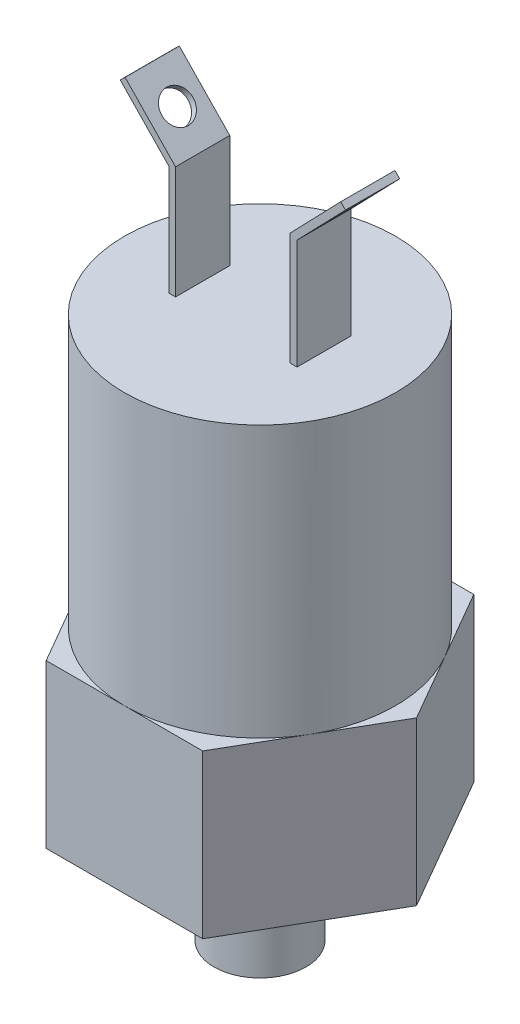
ISO-10303-21;
HEADER;
FILE_DESCRIPTION(('STEP AP214'),'2;1');
FILE_NAME('part.step','',(''),(''),'','','');
FILE_SCHEMA(('AUTOMOTIVE_DESIGN { 1 0 10303 214 1 1 1 1 }'));
ENDSEC;
DATA;
#1=APPLICATION_CONTEXT('core data for automotive mechanical design processes');
#2=APPLICATION_PROTOCOL_DEFINITION('international standard','automotive_design',2000,#1);
#3=PRODUCT_CONTEXT('',#1,'mechanical');
#4=PRODUCT('Part','Part','',(#3));
#5=PRODUCT_RELATED_PRODUCT_CATEGORY('part','',(#4));
#6=PRODUCT_DEFINITION_FORMATION('','',#4);
#7=PRODUCT_DEFINITION_CONTEXT('part definition',#1,'design');
#8=PRODUCT_DEFINITION('design','',#6,#7);
#9=PRODUCT_DEFINITION_SHAPE('','',#8);
#10=(LENGTH_UNIT() NAMED_UNIT(*) SI_UNIT(.MILLI.,.METRE.));
#11=(NAMED_UNIT(*) PLANE_ANGLE_UNIT() SI_UNIT($,.RADIAN.));
#12=(NAMED_UNIT(*) SI_UNIT($,.STERADIAN.) SOLID_ANGLE_UNIT());
#13=UNCERTAINTY_MEASURE_WITH_UNIT(LENGTH_MEASURE(1.E-05),#10,'distance_accuracy_value','');
#14=(GEOMETRIC_REPRESENTATION_CONTEXT(3) GLOBAL_UNCERTAINTY_ASSIGNED_CONTEXT((#13)) GLOBAL_UNIT_ASSIGNED_CONTEXT((#10,
#11,#12)) REPRESENTATION_CONTEXT('',''));
#15=CARTESIAN_POINT('',(0.,0.,0.));
#16=DIRECTION('',(0.,0.,1.));
#17=DIRECTION('',(1.,0.,0.));
#18=AXIS2_PLACEMENT_3D('',#15,#16,#17);
#19=CARTESIAN_POINT('',(-5.91916388064722,50.854740059957,2.54));
#20=DIRECTION('',(-0.719626723782185,-0.694361129685785,0.));
#21=DIRECTION('',(0.694361129685785,-0.719626723782185,0.));
#22=AXIS2_PLACEMENT_3D('',#19,#20,#21);
#23=PLANE('',#22);
#24=DIRECTION('',(-0.694361129685785,0.719626723782185,0.));
#25=VECTOR('',#24,1.);
#26=CARTESIAN_POINT('',(-5.91916388064722,50.854740059957,-2.54));
#27=LINE('',#26,#25);
#28=CARTESIAN_POINT('',(-6.00818239584637,50.9469976759295,-2.54));
#29=VERTEX_POINT('',#28);
#30=CARTESIAN_POINT('',(-10.5552709637061,55.6595403413248,-2.54));
#31=VERTEX_POINT('',#30);
#32=EDGE_CURVE('E181',#29,#31,#27,.T.);
#33=ORIENTED_EDGE('',*,*,#32,.F.);
#34=DIRECTION('',(0.,0.,-1.));
#35=VECTOR('',#34,1.);
#36=CARTESIAN_POINT('',(-6.00818239584637,50.9469976759295,2.54));
#37=LINE('',#36,#35);
#38=CARTESIAN_POINT('',(-6.00818239584637,50.9469976759295,2.54));
#39=VERTEX_POINT('',#38);
#40=EDGE_CURVE('E176',#39,#29,#37,.T.);
#41=ORIENTED_EDGE('',*,*,#40,.F.);
#42=DIRECTION('',(-0.694361129685785,0.719626723782185,0.));
#43=VECTOR('',#42,1.);
#44=CARTESIAN_POINT('',(-5.91916388064722,50.854740059957,2.54));
#45=LINE('',#44,#43);
#46=CARTESIAN_POINT('',(-10.5552709637061,55.6595403413248,2.54));
#47=VERTEX_POINT('',#46);
#48=EDGE_CURVE('E179',#39,#47,#45,.T.);
#49=ORIENTED_EDGE('',*,*,#48,.T.);
#50=DIRECTION('',(0.,0.,-1.));
#51=VECTOR('',#50,1.);
#52=CARTESIAN_POINT('',(-10.5552709637061,55.6595403413248,2.54));
#53=LINE('',#52,#51);
#54=EDGE_CURVE('E208',#47,#31,#53,.T.);
#55=ORIENTED_EDGE('',*,*,#54,.T.);
#56=EDGE_LOOP('',(#33,#41,#49,#55));
#57=FACE_BOUND('',#56,.T.);
#58=CARTESIAN_POINT('',(-8.19270816457709,53.2110113926547,0.));
#59=DIRECTION('',(-0.719626723782185,-0.694361129685785,0.));
#60=DIRECTION('',(0.694361129685785,-0.719626723782185,0.));
#61=AXIS2_PLACEMENT_3D('',#58,#59,#60);
#62=CIRCLE('',#61,1.4605);
#63=CARTESIAN_POINT('',(-7.17859373467101,52.1599965625708,0.));
#64=VERTEX_POINT('',#63);
#65=EDGE_CURVE('E211',#64,#64,#62,.T.);
#66=ORIENTED_EDGE('',*,*,#65,.F.);
#67=EDGE_LOOP('',(#66));
#68=FACE_BOUND('',#67,.T.);
#69=ADVANCED_FACE('F35',(#57,#68),#23,.T.);
#70=CARTESIAN_POINT('',(-5.46220091104553,51.2956593773075,2.54));
#71=DIRECTION('',(-0.719626723782185,-0.694361129685785,0.));
#72=DIRECTION('',(0.694361129685785,-0.719626723782185,0.));
#73=AXIS2_PLACEMENT_3D('',#70,#71,#72);
#74=PLANE('',#73);
#75=DIRECTION('',(-0.694361129685785,0.719626723782185,0.));
#76=VECTOR('',#75,1.);
#77=CARTESIAN_POINT('',(-5.46220091104553,51.2956593773075,-2.54));
#78=LINE('',#77,#76);
#79=CARTESIAN_POINT('',(-5.37318239584637,51.2034017613351,-2.54));
#80=VERTEX_POINT('',#79);
#81=CARTESIAN_POINT('',(-10.0983079941044,56.1004596586752,-2.54));
#82=VERTEX_POINT('',#81);
#83=EDGE_CURVE('E217',#80,#82,#78,.T.);
#84=ORIENTED_EDGE('',*,*,#83,.T.);
#85=DIRECTION('',(0.,0.,-1.));
#86=VECTOR('',#85,1.);
#87=CARTESIAN_POINT('',(-10.0983079941044,56.1004596586752,2.54));
#88=LINE('',#87,#86);
#89=CARTESIAN_POINT('',(-10.0983079941044,56.1004596586752,2.54));
#90=VERTEX_POINT('',#89);
#91=EDGE_CURVE('E222',#90,#82,#88,.T.);
#92=ORIENTED_EDGE('',*,*,#91,.F.);
#93=DIRECTION('',(-0.694361129685785,0.719626723782185,0.));
#94=VECTOR('',#93,1.);
#95=CARTESIAN_POINT('',(-5.46220091104553,51.2956593773075,2.54));
#96=LINE('',#95,#94);
#97=CARTESIAN_POINT('',(-5.37318239584637,51.2034017613351,2.54));
#98=VERTEX_POINT('',#97);
#99=EDGE_CURVE('E205',#98,#90,#96,.T.);
#100=ORIENTED_EDGE('',*,*,#99,.F.);
#101=DIRECTION('',(0.,0.,-1.));
#102=VECTOR('',#101,1.);
#103=CARTESIAN_POINT('',(-5.37318239584637,51.2034017613351,2.54));
#104=LINE('',#103,#102);
#105=EDGE_CURVE('E225',#98,#80,#104,.T.);
#106=ORIENTED_EDGE('',*,*,#105,.T.);
#107=EDGE_LOOP('',(#84,#92,#100,#106));
#108=FACE_BOUND('',#107,.T.);
#109=CARTESIAN_POINT('',(-7.73574519497541,53.6519307100052,0.));
#110=DIRECTION('',(-0.719626723782185,-0.694361129685785,0.));
#111=DIRECTION('',(0.694361129685785,-0.719626723782185,0.));
#112=AXIS2_PLACEMENT_3D('',#109,#110,#111);
#113=CIRCLE('',#112,1.4605);
#114=CARTESIAN_POINT('',(-6.72163076506932,52.6009158799213,0.));
#115=VERTEX_POINT('',#114);
#116=EDGE_CURVE('E677',#115,#115,#113,.T.);
#117=ORIENTED_EDGE('',*,*,#116,.T.);
#118=EDGE_LOOP('',(#117));
#119=FACE_BOUND('',#118,.T.);
#120=ADVANCED_FACE('F417',(#108,#119),#74,.F.);
#121=CARTESIAN_POINT('',(0.,40.64,0.));
#122=DIRECTION('',(0.,1.,0.));
#123=DIRECTION('',(0.,0.,1.));
#124=AXIS2_PLACEMENT_3D('',#121,#122,#123);
#125=PLANE('',#124);
#126=DIRECTION('',(0.,0.,-1.));
#127=VECTOR('',#126,1.);
#128=CARTESIAN_POINT('',(6.00818239584637,40.64,2.54));
#129=LINE('',#128,#127);
#130=CARTESIAN_POINT('',(6.00818239584637,40.64,2.54));
#131=VERTEX_POINT('',#130);
#132=CARTESIAN_POINT('',(6.00818239584637,40.64,-2.54));
#133=VERTEX_POINT('',#132);
#134=EDGE_CURVE('E270',#131,#133,#129,.T.);
#135=ORIENTED_EDGE('',*,*,#134,.F.);
#136=DIRECTION('',(-1.,0.,0.));
#137=VECTOR('',#136,1.);
#138=CARTESIAN_POINT('',(6.00818239584637,40.64,2.54));
#139=LINE('',#138,#137);
#140=CARTESIAN_POINT('',(5.37318239584637,40.64,2.54));
#141=VERTEX_POINT('',#140);
#142=EDGE_CURVE('E248',#131,#141,#139,.T.);
#143=ORIENTED_EDGE('',*,*,#142,.T.);
#144=DIRECTION('',(0.,0.,-1.));
#145=VECTOR('',#144,1.);
#146=CARTESIAN_POINT('',(5.37318239584637,40.64,2.54));
#147=LINE('',#146,#145);
#148=CARTESIAN_POINT('',(5.37318239584637,40.64,-2.54));
#149=VERTEX_POINT('',#148);
#150=EDGE_CURVE('E273',#141,#149,#147,.T.);
#151=ORIENTED_EDGE('',*,*,#150,.T.);
#152=DIRECTION('',(-1.,0.,0.));
#153=VECTOR('',#152,1.);
#154=CARTESIAN_POINT('',(6.00818239584637,40.64,-2.54));
#155=LINE('',#154,#153);
#156=EDGE_CURVE('E264',#133,#149,#155,.T.);
#157=ORIENTED_EDGE('',*,*,#156,.F.);
#158=EDGE_LOOP('',(#135,#143,#151,#157));
#159=FACE_BOUND('',#158,.T.);
#160=CARTESIAN_POINT('',(0.,40.64,0.));
#161=DIRECTION('',(0.,1.,0.));
#162=DIRECTION('',(0.,0.,1.));
#163=AXIS2_PLACEMENT_3D('',#160,#161,#162);
#164=CIRCLE('',#163,12.7);
#165=CARTESIAN_POINT('',(0.,40.64,12.7));
#166=VERTEX_POINT('',#165);
#167=EDGE_CURVE('E285',#166,#166,#164,.T.);
#168=ORIENTED_EDGE('',*,*,#167,.T.);
#169=EDGE_LOOP('',(#168));
#170=FACE_BOUND('',#169,.T.);
#171=DIRECTION('',(0.,0.,-1.));
#172=VECTOR('',#171,1.);
#173=CARTESIAN_POINT('',(-5.37318239584637,40.64,2.54));
#174=LINE('',#173,#172);
#175=CARTESIAN_POINT('',(-5.37318239584637,40.64,2.54));
#176=VERTEX_POINT('',#175);
#177=CARTESIAN_POINT('',(-5.37318239584637,40.64,-2.54));
#178=VERTEX_POINT('',#177);
#179=EDGE_CURVE('E55',#176,#178,#174,.T.);
#180=ORIENTED_EDGE('',*,*,#179,.F.);
#181=DIRECTION('',(1.,0.,0.));
#182=VECTOR('',#181,1.);
#183=CARTESIAN_POINT('',(-6.00818239584637,40.64,2.54));
#184=LINE('',#183,#182);
#185=CARTESIAN_POINT('',(-6.00818239584637,40.64,2.54));
#186=VERTEX_POINT('',#185);
#187=EDGE_CURVE('E50',#186,#176,#184,.T.);
#188=ORIENTED_EDGE('',*,*,#187,.F.);
#189=DIRECTION('',(0.,0.,-1.));
#190=VECTOR('',#189,1.);
#191=CARTESIAN_POINT('',(-6.00818239584637,40.64,2.54));
#192=LINE('',#191,#190);
#193=CARTESIAN_POINT('',(-6.00818239584637,40.64,-2.54));
#194=VERTEX_POINT('',#193);
#195=EDGE_CURVE('E187',#186,#194,#192,.T.);
#196=ORIENTED_EDGE('',*,*,#195,.T.);
#197=DIRECTION('',(1.,0.,0.));
#198=VECTOR('',#197,1.);
#199=CARTESIAN_POINT('',(-6.00818239584637,40.64,-2.54));
#200=LINE('',#199,#198);
#201=EDGE_CURVE('E213',#194,#178,#200,.T.);
#202=ORIENTED_EDGE('',*,*,#201,.T.);
#203=EDGE_LOOP('',(#180,#188,#196,#202));
#204=FACE_BOUND('',#203,.T.);
#205=ADVANCED_FACE('F422',(#159,#170,#204),#125,.T.);
#206=CARTESIAN_POINT('',(0.,0.,0.));
#207=DIRECTION('',(0.,1.,0.));
#208=DIRECTION('',(0.,0.,1.));
#209=AXIS2_PLACEMENT_3D('',#206,#207,#208);
#210=PLANE('',#209);
#211=DIRECTION('',(-0.5,0.,-0.866025403784439));
#212=VECTOR('',#211,1.);
#213=CARTESIAN_POINT('',(14.6646968374165,0.,0.));
#214=LINE('',#213,#212);
#215=CARTESIAN_POINT('',(14.6646968374165,0.,0.));
#216=VERTEX_POINT('',#215);
#217=CARTESIAN_POINT('',(7.33234841870825,0.,-12.7));
#218=VERTEX_POINT('',#217);
#219=EDGE_CURVE('E288',#216,#218,#214,.T.);
#220=ORIENTED_EDGE('',*,*,#219,.F.);
#221=DIRECTION('',(0.5,0.,-0.866025403784439));
#222=VECTOR('',#221,1.);
#223=CARTESIAN_POINT('',(7.33234841870825,0.,12.7));
#224=LINE('',#223,#222);
#225=CARTESIAN_POINT('',(7.33234841870825,0.,12.7));
#226=VERTEX_POINT('',#225);
#227=EDGE_CURVE('E326',#226,#216,#224,.T.);
#228=ORIENTED_EDGE('',*,*,#227,.F.);
#229=DIRECTION('',(1.,0.,0.));
#230=VECTOR('',#229,1.);
#231=CARTESIAN_POINT('',(-7.33234841870824,0.,12.7));
#232=LINE('',#231,#230);
#233=CARTESIAN_POINT('',(-7.33234841870824,0.,12.7));
#234=VERTEX_POINT('',#233);
#235=EDGE_CURVE('E324',#234,#226,#232,.T.);
#236=ORIENTED_EDGE('',*,*,#235,.F.);
#237=DIRECTION('',(0.5,0.,0.866025403784439));
#238=VECTOR('',#237,1.);
#239=CARTESIAN_POINT('',(-14.6646968374165,0.,0.));
#240=LINE('',#239,#238);
#241=CARTESIAN_POINT('',(-14.6646968374165,0.,0.));
#242=VERTEX_POINT('',#241);
#243=EDGE_CURVE('E322',#242,#234,#240,.T.);
#244=ORIENTED_EDGE('',*,*,#243,.F.);
#245=DIRECTION('',(-0.5,0.,0.866025403784439));
#246=VECTOR('',#245,1.);
#247=CARTESIAN_POINT('',(-7.33234841870825,0.,-12.7));
#248=LINE('',#247,#246);
#249=CARTESIAN_POINT('',(-7.33234841870825,0.,-12.7));
#250=VERTEX_POINT('',#249);
#251=EDGE_CURVE('E320',#250,#242,#248,.T.);
#252=ORIENTED_EDGE('',*,*,#251,.F.);
#253=DIRECTION('',(-1.,0.,0.));
#254=VECTOR('',#253,1.);
#255=CARTESIAN_POINT('',(7.33234841870825,0.,-12.7));
#256=LINE('',#255,#254);
#257=EDGE_CURVE('E318',#218,#250,#256,.T.);
#258=ORIENTED_EDGE('',*,*,#257,.F.);
#259=EDGE_LOOP('',(#220,#228,#236,#244,#252,#258));
#260=FACE_BOUND('',#259,.T.);
#261=CARTESIAN_POINT('',(0.,0.,0.));
#262=DIRECTION('',(0.,1.,0.));
#263=DIRECTION('',(0.,0.,1.));
#264=AXIS2_PLACEMENT_3D('',#261,#262,#263);
#265=CIRCLE('',#264,4.3053);
#266=CARTESIAN_POINT('',(0.,0.,4.3053));
#267=VERTEX_POINT('',#266);
#268=EDGE_CURVE('E11',#267,#267,#265,.F.);
#269=ORIENTED_EDGE('',*,*,#268,.F.);
#270=EDGE_LOOP('',(#269));
#271=FACE_BOUND('',#270,.T.);
#272=ADVANCED_FACE('F376',(#260,#271),#210,.F.);
#273=CARTESIAN_POINT('',(0.,15.24,0.));
#274=DIRECTION('',(0.,1.,0.));
#275=DIRECTION('',(0.,0.,1.));
#276=AXIS2_PLACEMENT_3D('',#273,#274,#275);
#277=PLANE('',#276);
#278=CARTESIAN_POINT('',(0.,15.24,0.));
#279=DIRECTION('',(0.,1.,0.));
#280=DIRECTION('',(0.,0.,1.));
#281=AXIS2_PLACEMENT_3D('',#278,#279,#280);
#282=CIRCLE('',#281,12.7);
#283=CARTESIAN_POINT('',(0.,15.24,12.7));
#284=VERTEX_POINT('',#283);
#285=CARTESIAN_POINT('',(10.9985226280624,15.24,6.35));
#286=VERTEX_POINT('',#285);
#287=EDGE_CURVE('E284',#284,#286,#282,.T.);
#288=ORIENTED_EDGE('',*,*,#287,.F.);
#289=DIRECTION('',(1.,0.,0.));
#290=VECTOR('',#289,1.);
#291=CARTESIAN_POINT('',(-7.33234841870824,15.24,12.7));
#292=LINE('',#291,#290);
#293=CARTESIAN_POINT('',(7.33234841870825,15.24,12.7));
#294=VERTEX_POINT('',#293);
#295=EDGE_CURVE('E308',#284,#294,#292,.T.);
#296=ORIENTED_EDGE('',*,*,#295,.T.);
#297=DIRECTION('',(0.5,0.,-0.866025403784439));
#298=VECTOR('',#297,1.);
#299=CARTESIAN_POINT('',(7.33234841870825,15.24,12.7));
#300=LINE('',#299,#298);
#301=EDGE_CURVE('E312',#294,#286,#300,.T.);
#302=ORIENTED_EDGE('',*,*,#301,.T.);
#303=EDGE_LOOP('',(#288,#296,#302));
#304=FACE_BOUND('',#303,.T.);
#305=ADVANCED_FACE('F366',(#304),#277,.T.);
#306=CARTESIAN_POINT('',(10.9985226280624,15.24,-6.35));
#307=VERTEX_POINT('',#306);
#308=EDGE_CURVE('E43',#286,#307,#282,.T.);
#309=ORIENTED_EDGE('',*,*,#308,.F.);
#310=CARTESIAN_POINT('',(14.6646968374165,15.24,0.));
#311=VERTEX_POINT('',#310);
#312=EDGE_CURVE('E311',#286,#311,#300,.T.);
#313=ORIENTED_EDGE('',*,*,#312,.T.);
#314=DIRECTION('',(-0.5,0.,-0.866025403784439));
#315=VECTOR('',#314,1.);
#316=CARTESIAN_POINT('',(14.6646968374165,15.24,0.));
#317=LINE('',#316,#315);
#318=EDGE_CURVE('E292',#311,#307,#317,.T.);
#319=ORIENTED_EDGE('',*,*,#318,.T.);
#320=EDGE_LOOP('',(#309,#313,#319));
#321=FACE_BOUND('',#320,.T.);
#322=ADVANCED_FACE('F359',(#321),#277,.T.);
#323=CARTESIAN_POINT('',(0.,15.24,-12.7));
#324=VERTEX_POINT('',#323);
#325=EDGE_CURVE('E352',#307,#324,#282,.T.);
#326=ORIENTED_EDGE('',*,*,#325,.F.);
#327=CARTESIAN_POINT('',(7.33234841870825,15.24,-12.7));
#328=VERTEX_POINT('',#327);
#329=EDGE_CURVE('E296',#307,#328,#317,.T.);
#330=ORIENTED_EDGE('',*,*,#329,.T.);
#331=DIRECTION('',(-1.,0.,0.));
#332=VECTOR('',#331,1.);
#333=CARTESIAN_POINT('',(7.33234841870825,15.24,-12.7));
#334=LINE('',#333,#332);
#335=EDGE_CURVE('E297',#328,#324,#334,.T.);
#336=ORIENTED_EDGE('',*,*,#335,.T.);
#337=EDGE_LOOP('',(#326,#330,#336));
#338=FACE_BOUND('',#337,.T.);
#339=ADVANCED_FACE('F383',(#338),#277,.T.);
#340=CARTESIAN_POINT('',(-10.9985226280624,15.24,-6.35));
#341=VERTEX_POINT('',#340);
#342=EDGE_CURVE('E350',#324,#341,#282,.T.);
#343=ORIENTED_EDGE('',*,*,#342,.F.);
#344=CARTESIAN_POINT('',(-7.33234841870825,15.24,-12.7));
#345=VERTEX_POINT('',#344);
#346=EDGE_CURVE('E295',#324,#345,#334,.T.);
#347=ORIENTED_EDGE('',*,*,#346,.T.);
#348=DIRECTION('',(-0.5,0.,0.866025403784439));
#349=VECTOR('',#348,1.);
#350=CARTESIAN_POINT('',(-7.33234841870825,15.24,-12.7));
#351=LINE('',#350,#349);
#352=EDGE_CURVE('E301',#345,#341,#351,.T.);
#353=ORIENTED_EDGE('',*,*,#352,.T.);
#354=EDGE_LOOP('',(#343,#347,#353));
#355=FACE_BOUND('',#354,.T.);
#356=ADVANCED_FACE('F389',(#355),#277,.T.);
#357=CARTESIAN_POINT('',(-10.9985226280624,15.24,6.35));
#358=VERTEX_POINT('',#357);
#359=EDGE_CURVE('E347',#341,#358,#282,.T.);
#360=ORIENTED_EDGE('',*,*,#359,.F.);
#361=CARTESIAN_POINT('',(-14.6646968374165,15.24,0.));
#362=VERTEX_POINT('',#361);
#363=EDGE_CURVE('E300',#341,#362,#351,.T.);
#364=ORIENTED_EDGE('',*,*,#363,.T.);
#365=DIRECTION('',(0.5,0.,0.866025403784439));
#366=VECTOR('',#365,1.);
#367=CARTESIAN_POINT('',(-14.6646968374165,15.24,0.));
#368=LINE('',#367,#366);
#369=EDGE_CURVE('E305',#362,#358,#368,.T.);
#370=ORIENTED_EDGE('',*,*,#369,.T.);
#371=EDGE_LOOP('',(#360,#364,#370));
#372=FACE_BOUND('',#371,.T.);
#373=ADVANCED_FACE('F396',(#372),#277,.T.);
#374=CARTESIAN_POINT('',(14.6646968374165,15.24,0.));
#375=DIRECTION('',(-0.866025403784439,0.,0.5));
#376=DIRECTION('',(0.5,0.,0.866025403784439));
#377=AXIS2_PLACEMENT_3D('',#374,#375,#376);
#378=PLANE('',#377);
#379=ORIENTED_EDGE('',*,*,#219,.T.);
#380=DIRECTION('',(0.,-1.,0.));
#381=VECTOR('',#380,1.);
#382=CARTESIAN_POINT('',(7.33234841870825,15.24,-12.7));
#383=LINE('',#382,#381);
#384=EDGE_CURVE('E341',#328,#218,#383,.T.);
#385=ORIENTED_EDGE('',*,*,#384,.F.);
#386=ORIENTED_EDGE('',*,*,#329,.F.);
#387=ORIENTED_EDGE('',*,*,#318,.F.);
#388=DIRECTION('',(0.,-1.,0.));
#389=VECTOR('',#388,1.);
#390=CARTESIAN_POINT('',(14.6646968374165,15.24,0.));
#391=LINE('',#390,#389);
#392=EDGE_CURVE('E315',#311,#216,#391,.T.);
#393=ORIENTED_EDGE('',*,*,#392,.T.);
#394=EDGE_LOOP('',(#379,#385,#386,#387,#393));
#395=FACE_BOUND('',#394,.T.);
#396=ADVANCED_FACE('F37',(#395),#378,.F.);
#397=CARTESIAN_POINT('',(7.33234841870825,15.24,-12.7));
#398=DIRECTION('',(0.,0.,1.));
#399=DIRECTION('',(1.,0.,0.));
#400=AXIS2_PLACEMENT_3D('',#397,#398,#399);
#401=PLANE('',#400);
#402=ORIENTED_EDGE('',*,*,#257,.T.);
#403=DIRECTION('',(0.,-1.,0.));
#404=VECTOR('',#403,1.);
#405=CARTESIAN_POINT('',(-7.33234841870825,15.24,-12.7));
#406=LINE('',#405,#404);
#407=EDGE_CURVE('E339',#345,#250,#406,.T.);
#408=ORIENTED_EDGE('',*,*,#407,.F.);
#409=ORIENTED_EDGE('',*,*,#346,.F.);
#410=ORIENTED_EDGE('',*,*,#335,.F.);
#411=ORIENTED_EDGE('',*,*,#384,.T.);
#412=EDGE_LOOP('',(#402,#408,#409,#410,#411));
#413=FACE_BOUND('',#412,.T.);
#414=ADVANCED_FACE('F385',(#413),#401,.F.);
#415=CARTESIAN_POINT('',(-7.33234841870825,15.24,-12.7));
#416=DIRECTION('',(0.866025403784439,0.,0.5));
#417=DIRECTION('',(0.5,0.,-0.866025403784439));
#418=AXIS2_PLACEMENT_3D('',#415,#416,#417);
#419=PLANE('',#418);
#420=ORIENTED_EDGE('',*,*,#251,.T.);
#421=DIRECTION('',(0.,-1.,0.));
#422=VECTOR('',#421,1.);
#423=CARTESIAN_POINT('',(-14.6646968374165,15.24,0.));
#424=LINE('',#423,#422);
#425=EDGE_CURVE('E336',#362,#242,#424,.T.);
#426=ORIENTED_EDGE('',*,*,#425,.F.);
#427=ORIENTED_EDGE('',*,*,#363,.F.);
#428=ORIENTED_EDGE('',*,*,#352,.F.);
#429=ORIENTED_EDGE('',*,*,#407,.T.);
#430=EDGE_LOOP('',(#420,#426,#427,#428,#429));
#431=FACE_BOUND('',#430,.T.);
#432=ADVANCED_FACE('F392',(#431),#419,.F.);
#433=CARTESIAN_POINT('',(-14.6646968374165,15.24,0.));
#434=DIRECTION('',(0.866025403784439,0.,-0.5));
#435=DIRECTION('',(-0.5,0.,-0.866025403784439));
#436=AXIS2_PLACEMENT_3D('',#433,#434,#435);
#437=PLANE('',#436);
#438=ORIENTED_EDGE('',*,*,#243,.T.);
#439=DIRECTION('',(0.,-1.,0.));
#440=VECTOR('',#439,1.);
#441=CARTESIAN_POINT('',(-7.33234841870824,15.24,12.7));
#442=LINE('',#441,#440);
#443=CARTESIAN_POINT('',(-7.33234841870824,15.24,12.7));
#444=VERTEX_POINT('',#443);
#445=EDGE_CURVE('E333',#444,#234,#442,.T.);
#446=ORIENTED_EDGE('',*,*,#445,.F.);
#447=EDGE_CURVE('E304',#358,#444,#368,.T.);
#448=ORIENTED_EDGE('',*,*,#447,.F.);
#449=ORIENTED_EDGE('',*,*,#369,.F.);
#450=ORIENTED_EDGE('',*,*,#425,.T.);
#451=EDGE_LOOP('',(#438,#446,#448,#449,#450));
#452=FACE_BOUND('',#451,.T.);
#453=ADVANCED_FACE('F399',(#452),#437,.F.);
#454=CARTESIAN_POINT('',(-7.33234841870824,15.24,12.7));
#455=DIRECTION('',(0.,0.,-1.));
#456=DIRECTION('',(-1.,0.,0.));
#457=AXIS2_PLACEMENT_3D('',#454,#455,#456);
#458=PLANE('',#457);
#459=ORIENTED_EDGE('',*,*,#235,.T.);
#460=DIRECTION('',(0.,-1.,0.));
#461=VECTOR('',#460,1.);
#462=CARTESIAN_POINT('',(7.33234841870825,15.24,12.7));
#463=LINE('',#462,#461);
#464=EDGE_CURVE('E330',#294,#226,#463,.T.);
#465=ORIENTED_EDGE('',*,*,#464,.F.);
#466=ORIENTED_EDGE('',*,*,#295,.F.);
#467=EDGE_CURVE('E309',#444,#284,#292,.T.);
#468=ORIENTED_EDGE('',*,*,#467,.F.);
#469=ORIENTED_EDGE('',*,*,#445,.T.);
#470=EDGE_LOOP('',(#459,#465,#466,#468,#469));
#471=FACE_BOUND('',#470,.T.);
#472=ADVANCED_FACE('F371',(#471),#458,.F.);
#473=CARTESIAN_POINT('',(7.33234841870825,15.24,12.7));
#474=DIRECTION('',(-0.866025403784439,0.,-0.5));
#475=DIRECTION('',(-0.5,0.,0.866025403784439));
#476=AXIS2_PLACEMENT_3D('',#473,#474,#475);
#477=PLANE('',#476);
#478=ORIENTED_EDGE('',*,*,#227,.T.);
#479=ORIENTED_EDGE('',*,*,#392,.F.);
#480=ORIENTED_EDGE('',*,*,#312,.F.);
#481=ORIENTED_EDGE('',*,*,#301,.F.);
#482=ORIENTED_EDGE('',*,*,#464,.T.);
#483=EDGE_LOOP('',(#478,#479,#480,#481,#482));
#484=FACE_BOUND('',#483,.T.);
#485=ADVANCED_FACE('F364',(#484),#477,.F.);
#486=EDGE_CURVE('E291',#358,#284,#282,.T.);
#487=ORIENTED_EDGE('',*,*,#486,.F.);
#488=ORIENTED_EDGE('',*,*,#447,.T.);
#489=ORIENTED_EDGE('',*,*,#467,.T.);
#490=EDGE_LOOP('',(#487,#488,#489));
#491=FACE_BOUND('',#490,.T.);
#492=ADVANCED_FACE('F402',(#491),#277,.T.);
#493=CARTESIAN_POINT('',(0.,40.64,0.));
#494=DIRECTION('',(0.,-1.,0.));
#495=DIRECTION('',(0.,0.,-1.));
#496=AXIS2_PLACEMENT_3D('',#493,#494,#495);
#497=CYLINDRICAL_SURFACE('',#496,12.7);
#498=ORIENTED_EDGE('',*,*,#167,.F.);
#499=EDGE_LOOP('',(#498));
#500=FACE_BOUND('',#499,.T.);
#501=ORIENTED_EDGE('',*,*,#287,.T.);
#502=ORIENTED_EDGE('',*,*,#308,.T.);
#503=ORIENTED_EDGE('',*,*,#325,.T.);
#504=ORIENTED_EDGE('',*,*,#342,.T.);
#505=ORIENTED_EDGE('',*,*,#359,.T.);
#506=ORIENTED_EDGE('',*,*,#486,.T.);
#507=EDGE_LOOP('',(#501,#502,#503,#504,#505,#506));
#508=FACE_BOUND('',#507,.T.);
#509=ADVANCED_FACE('F355',(#500,#508),#497,.T.);
#510=CARTESIAN_POINT('',(0.,-10.16,0.));
#511=DIRECTION('',(0.,1.,0.));
#512=DIRECTION('',(0.,0.,1.));
#513=AXIS2_PLACEMENT_3D('',#510,#511,#512);
#514=CYLINDRICAL_SURFACE('',#513,4.3053);
#515=CARTESIAN_POINT('',(0.,-10.16,0.));
#516=DIRECTION('',(0.,-1.,0.));
#517=DIRECTION('',(0.,0.,-1.));
#518=AXIS2_PLACEMENT_3D('',#515,#516,#517);
#519=CIRCLE('',#518,4.3053);
#520=CARTESIAN_POINT('',(0.,-10.16,-4.3053));
#521=VERTEX_POINT('',#520);
#522=EDGE_CURVE('E281',#521,#521,#519,.T.);
#523=ORIENTED_EDGE('',*,*,#522,.F.);
#524=EDGE_LOOP('',(#523));
#525=FACE_BOUND('',#524,.T.);
#526=ORIENTED_EDGE('',*,*,#268,.T.);
#527=EDGE_LOOP('',(#526));
#528=FACE_BOUND('',#527,.T.);
#529=ADVANCED_FACE('F409',(#525,#528),#514,.T.);
#530=CARTESIAN_POINT('',(0.,-10.16,0.));
#531=DIRECTION('',(0.,-1.,0.));
#532=DIRECTION('',(0.,0.,-1.));
#533=AXIS2_PLACEMENT_3D('',#530,#531,#532);
#534=PLANE('',#533);
#535=ORIENTED_EDGE('',*,*,#522,.T.);
#536=EDGE_LOOP('',(#535));
#537=FACE_BOUND('',#536,.T.);
#538=ADVANCED_FACE('F459',(#537),#534,.T.);
#539=CARTESIAN_POINT('',(5.91916388064722,50.854740059957,2.54));
#540=DIRECTION('',(-0.719626723782185,0.694361129685785,0.));
#541=DIRECTION('',(-0.694361129685785,-0.719626723782185,0.));
#542=AXIS2_PLACEMENT_3D('',#539,#540,#541);
#543=PLANE('',#542);
#544=CARTESIAN_POINT('',(8.19270816457709,53.2110113926547,0.));
#545=DIRECTION('',(-0.719626723782185,0.694361129685785,0.));
#546=DIRECTION('',(-0.694361129685785,-0.719626723782185,0.));
#547=AXIS2_PLACEMENT_3D('',#544,#545,#546);
#548=CIRCLE('',#547,1.4605);
#549=CARTESIAN_POINT('',(7.17859373467101,52.1599965625708,0.));
#550=VERTEX_POINT('',#549);
#551=EDGE_CURVE('E232',#550,#550,#548,.F.);
#552=ORIENTED_EDGE('',*,*,#551,.F.);
#553=EDGE_LOOP('',(#552));
#554=FACE_BOUND('',#553,.T.);
#555=DIRECTION('',(0.694361129685785,0.719626723782185,0.));
#556=VECTOR('',#555,1.);
#557=CARTESIAN_POINT('',(5.91916388064722,50.854740059957,-2.54));
#558=LINE('',#557,#556);
#559=CARTESIAN_POINT('',(6.00818239584637,50.9469976759295,-2.54));
#560=VERTEX_POINT('',#559);
#561=CARTESIAN_POINT('',(10.5552709637061,55.6595403413248,-2.54));
#562=VERTEX_POINT('',#561);
#563=EDGE_CURVE('E235',#560,#562,#558,.T.);
#564=ORIENTED_EDGE('',*,*,#563,.T.);
#565=DIRECTION('',(0.,0.,-1.));
#566=VECTOR('',#565,1.);
#567=CARTESIAN_POINT('',(10.5552709637061,55.6595403413248,2.54));
#568=LINE('',#567,#566);
#569=CARTESIAN_POINT('',(10.5552709637061,55.6595403413248,2.54));
#570=VERTEX_POINT('',#569);
#571=EDGE_CURVE('E279',#570,#562,#568,.T.);
#572=ORIENTED_EDGE('',*,*,#571,.F.);
#573=DIRECTION('',(0.694361129685785,0.719626723782185,0.));
#574=VECTOR('',#573,1.);
#575=CARTESIAN_POINT('',(5.91916388064722,50.854740059957,2.54));
#576=LINE('',#575,#574);
#577=CARTESIAN_POINT('',(6.00818239584637,50.9469976759295,2.54));
#578=VERTEX_POINT('',#577);
#579=EDGE_CURVE('E236',#578,#570,#576,.T.);
#580=ORIENTED_EDGE('',*,*,#579,.F.);
#581=DIRECTION('',(0.,0.,-1.));
#582=VECTOR('',#581,1.);
#583=CARTESIAN_POINT('',(6.00818239584637,50.9469976759295,2.54));
#584=LINE('',#583,#582);
#585=EDGE_CURVE('E252',#578,#560,#584,.T.);
#586=ORIENTED_EDGE('',*,*,#585,.T.);
#587=EDGE_LOOP('',(#564,#572,#580,#586));
#588=FACE_BOUND('',#587,.T.);
#589=ADVANCED_FACE('F455',(#554,#588),#543,.F.);
#590=CARTESIAN_POINT('',(10.0983079941044,56.1004596586752,2.54));
#591=DIRECTION('',(0.694361129685788,0.719626723782182,0.));
#592=DIRECTION('',(-0.719626723782182,0.694361129685788,0.));
#593=AXIS2_PLACEMENT_3D('',#590,#591,#592);
#594=PLANE('',#593);
#595=DIRECTION('',(0.719626723782182,-0.694361129685788,0.));
#596=VECTOR('',#595,1.);
#597=CARTESIAN_POINT('',(10.0983079941044,56.1004596586752,-2.54));
#598=LINE('',#597,#596);
#599=CARTESIAN_POINT('',(10.0983079941044,56.1004596586752,-2.54));
#600=VERTEX_POINT('',#599);
#601=EDGE_CURVE('E255',#600,#562,#598,.T.);
#602=ORIENTED_EDGE('',*,*,#601,.F.);
#603=DIRECTION('',(0.,0.,-1.));
#604=VECTOR('',#603,1.);
#605=CARTESIAN_POINT('',(10.0983079941044,56.1004596586752,2.54));
#606=LINE('',#605,#604);
#607=CARTESIAN_POINT('',(10.0983079941044,56.1004596586752,2.54));
#608=VERTEX_POINT('',#607);
#609=EDGE_CURVE('E277',#608,#600,#606,.T.);
#610=ORIENTED_EDGE('',*,*,#609,.F.);
#611=DIRECTION('',(0.719626723782182,-0.694361129685788,0.));
#612=VECTOR('',#611,1.);
#613=CARTESIAN_POINT('',(10.0983079941044,56.1004596586752,2.54));
#614=LINE('',#613,#612);
#615=EDGE_CURVE('E238',#608,#570,#614,.T.);
#616=ORIENTED_EDGE('',*,*,#615,.T.);
#617=ORIENTED_EDGE('',*,*,#571,.T.);
#618=EDGE_LOOP('',(#602,#610,#616,#617));
#619=FACE_BOUND('',#618,.T.);
#620=ADVANCED_FACE('F451',(#619),#594,.T.);
#621=CARTESIAN_POINT('',(5.46220091104553,51.2956593773075,2.54));
#622=DIRECTION('',(-0.719626723782185,0.694361129685785,0.));
#623=DIRECTION('',(-0.694361129685785,-0.719626723782185,0.));
#624=AXIS2_PLACEMENT_3D('',#621,#622,#623);
#625=PLANE('',#624);
#626=CARTESIAN_POINT('',(7.73574519497541,53.6519307100052,0.));
#627=DIRECTION('',(-0.719626723782185,0.694361129685785,0.));
#628=DIRECTION('',(-0.694361129685785,-0.719626723782185,0.));
#629=AXIS2_PLACEMENT_3D('',#626,#627,#628);
#630=CIRCLE('',#629,1.4605);
#631=CARTESIAN_POINT('',(6.72163076506932,52.6009158799213,0.));
#632=VERTEX_POINT('',#631);
#633=EDGE_CURVE('E186',#632,#632,#630,.T.);
#634=ORIENTED_EDGE('',*,*,#633,.F.);
#635=EDGE_LOOP('',(#634));
#636=FACE_BOUND('',#635,.T.);
#637=DIRECTION('',(0.694361129685785,0.719626723782185,0.));
#638=VECTOR('',#637,1.);
#639=CARTESIAN_POINT('',(5.46220091104553,51.2956593773075,-2.54));
#640=LINE('',#639,#638);
#641=CARTESIAN_POINT('',(5.37318239584637,51.2034017613351,-2.54));
#642=VERTEX_POINT('',#641);
#643=EDGE_CURVE('E258',#642,#600,#640,.T.);
#644=ORIENTED_EDGE('',*,*,#643,.F.);
#645=DIRECTION('',(0.,0.,-1.));
#646=VECTOR('',#645,1.);
#647=CARTESIAN_POINT('',(5.37318239584637,51.2034017613351,2.54));
#648=LINE('',#647,#646);
#649=CARTESIAN_POINT('',(5.37318239584637,51.2034017613351,2.54));
#650=VERTEX_POINT('',#649);
#651=EDGE_CURVE('E275',#650,#642,#648,.T.);
#652=ORIENTED_EDGE('',*,*,#651,.F.);
#653=DIRECTION('',(0.694361129685785,0.719626723782185,0.));
#654=VECTOR('',#653,1.);
#655=CARTESIAN_POINT('',(5.46220091104553,51.2956593773075,2.54));
#656=LINE('',#655,#654);
#657=EDGE_CURVE('E242',#650,#608,#656,.T.);
#658=ORIENTED_EDGE('',*,*,#657,.T.);
#659=ORIENTED_EDGE('',*,*,#609,.T.);
#660=EDGE_LOOP('',(#644,#652,#658,#659));
#661=FACE_BOUND('',#660,.T.);
#662=ADVANCED_FACE('F447',(#636,#661),#625,.T.);
#663=CARTESIAN_POINT('',(5.37318239584637,40.64,2.54));
#664=DIRECTION('',(-1.,0.,0.));
#665=DIRECTION('',(0.,0.,1.));
#666=AXIS2_PLACEMENT_3D('',#663,#664,#665);
#667=PLANE('',#666);
#668=DIRECTION('',(0.,1.,0.));
#669=VECTOR('',#668,1.);
#670=CARTESIAN_POINT('',(5.37318239584637,40.64,-2.54));
#671=LINE('',#670,#669);
#672=EDGE_CURVE('E261',#149,#642,#671,.T.);
#673=ORIENTED_EDGE('',*,*,#672,.F.);
#674=ORIENTED_EDGE('',*,*,#150,.F.);
#675=DIRECTION('',(0.,1.,0.));
#676=VECTOR('',#675,1.);
#677=CARTESIAN_POINT('',(5.37318239584637,40.64,2.54));
#678=LINE('',#677,#676);
#679=EDGE_CURVE('E245',#141,#650,#678,.T.);
#680=ORIENTED_EDGE('',*,*,#679,.T.);
#681=ORIENTED_EDGE('',*,*,#651,.T.);
#682=EDGE_LOOP('',(#673,#674,#680,#681));
#683=FACE_BOUND('',#682,.T.);
#684=ADVANCED_FACE('F443',(#683),#667,.T.);
#685=CARTESIAN_POINT('',(6.00818239584637,40.64,2.54));
#686=DIRECTION('',(-1.,0.,0.));
#687=DIRECTION('',(0.,0.,1.));
#688=AXIS2_PLACEMENT_3D('',#685,#686,#687);
#689=PLANE('',#688);
#690=DIRECTION('',(0.,1.,0.));
#691=VECTOR('',#690,1.);
#692=CARTESIAN_POINT('',(6.00818239584637,40.64,-2.54));
#693=LINE('',#692,#691);
#694=EDGE_CURVE('E239',#133,#560,#693,.T.);
#695=ORIENTED_EDGE('',*,*,#694,.T.);
#696=ORIENTED_EDGE('',*,*,#585,.F.);
#697=DIRECTION('',(0.,1.,0.));
#698=VECTOR('',#697,1.);
#699=CARTESIAN_POINT('',(6.00818239584637,40.64,2.54));
#700=LINE('',#699,#698);
#701=EDGE_CURVE('E250',#131,#578,#700,.T.);
#702=ORIENTED_EDGE('',*,*,#701,.F.);
#703=ORIENTED_EDGE('',*,*,#134,.T.);
#704=EDGE_LOOP('',(#695,#696,#702,#703));
#705=FACE_BOUND('',#704,.T.);
#706=ADVANCED_FACE('F436',(#705),#689,.F.);
#707=CARTESIAN_POINT('',(0.,0.,2.54));
#708=DIRECTION('',(0.,0.,-1.));
#709=DIRECTION('',(-1.,0.,0.));
#710=AXIS2_PLACEMENT_3D('',#707,#708,#709);
#711=PLANE('',#710);
#712=ORIENTED_EDGE('',*,*,#579,.T.);
#713=ORIENTED_EDGE('',*,*,#615,.F.);
#714=ORIENTED_EDGE('',*,*,#657,.F.);
#715=ORIENTED_EDGE('',*,*,#679,.F.);
#716=ORIENTED_EDGE('',*,*,#142,.F.);
#717=ORIENTED_EDGE('',*,*,#701,.T.);
#718=EDGE_LOOP('',(#712,#713,#714,#715,#716,#717));
#719=FACE_BOUND('',#718,.T.);
#720=ADVANCED_FACE('F433',(#719),#711,.F.);
#721=CARTESIAN_POINT('',(0.,0.,-2.54));
#722=DIRECTION('',(0.,0.,-1.));
#723=DIRECTION('',(-1.,0.,0.));
#724=AXIS2_PLACEMENT_3D('',#721,#722,#723);
#725=PLANE('',#724);
#726=ORIENTED_EDGE('',*,*,#563,.F.);
#727=ORIENTED_EDGE('',*,*,#694,.F.);
#728=ORIENTED_EDGE('',*,*,#156,.T.);
#729=ORIENTED_EDGE('',*,*,#672,.T.);
#730=ORIENTED_EDGE('',*,*,#643,.T.);
#731=ORIENTED_EDGE('',*,*,#601,.T.);
#732=EDGE_LOOP('',(#726,#727,#728,#729,#730,#731));
#733=FACE_BOUND('',#732,.T.);
#734=ADVANCED_FACE('F431',(#733),#725,.T.);
#735=CARTESIAN_POINT('',(43.2106059749876,19.4225676352246,0.));
#736=DIRECTION('',(-0.719626723782185,0.694361129685785,0.));
#737=DIRECTION('',(-0.694361129685785,-0.719626723782185,0.));
#738=AXIS2_PLACEMENT_3D('',#735,#736,#737);
#739=CYLINDRICAL_SURFACE('',#738,1.4605);
#740=ORIENTED_EDGE('',*,*,#633,.T.);
#741=EDGE_LOOP('',(#740));
#742=FACE_BOUND('',#741,.T.);
#743=ORIENTED_EDGE('',*,*,#551,.T.);
#744=EDGE_LOOP('',(#743));
#745=FACE_BOUND('',#744,.T.);
#746=ADVANCED_FACE('F428',(#742,#745),#739,.F.);
#747=CARTESIAN_POINT('',(-6.00818239584637,40.64,2.54));
#748=DIRECTION('',(-1.,0.,0.));
#749=DIRECTION('',(0.,0.,1.));
#750=AXIS2_PLACEMENT_3D('',#747,#748,#749);
#751=PLANE('',#750);
#752=DIRECTION('',(0.,1.,0.));
#753=VECTOR('',#752,1.);
#754=CARTESIAN_POINT('',(-6.00818239584637,40.64,-2.54));
#755=LINE('',#754,#753);
#756=EDGE_CURVE('E210',#194,#29,#755,.T.);
#757=ORIENTED_EDGE('',*,*,#756,.F.);
#758=ORIENTED_EDGE('',*,*,#195,.F.);
#759=DIRECTION('',(0.,1.,0.));
#760=VECTOR('',#759,1.);
#761=CARTESIAN_POINT('',(-6.00818239584637,40.64,2.54));
#762=LINE('',#761,#760);
#763=EDGE_CURVE('E192',#186,#39,#762,.T.);
#764=ORIENTED_EDGE('',*,*,#763,.T.);
#765=ORIENTED_EDGE('',*,*,#40,.T.);
#766=EDGE_LOOP('',(#757,#758,#764,#765));
#767=FACE_BOUND('',#766,.T.);
#768=ADVANCED_FACE('F198',(#767),#751,.T.);
#769=CARTESIAN_POINT('',(-5.37318239584637,40.64,2.54));
#770=DIRECTION('',(-1.,0.,0.));
#771=DIRECTION('',(0.,0.,1.));
#772=AXIS2_PLACEMENT_3D('',#769,#770,#771);
#773=PLANE('',#772);
#774=DIRECTION('',(0.,1.,0.));
#775=VECTOR('',#774,1.);
#776=CARTESIAN_POINT('',(-5.37318239584637,40.64,-2.54));
#777=LINE('',#776,#775);
#778=EDGE_CURVE('E215',#178,#80,#777,.T.);
#779=ORIENTED_EDGE('',*,*,#778,.T.);
#780=ORIENTED_EDGE('',*,*,#105,.F.);
#781=DIRECTION('',(0.,1.,0.));
#782=VECTOR('',#781,1.);
#783=CARTESIAN_POINT('',(-5.37318239584637,40.64,2.54));
#784=LINE('',#783,#782);
#785=EDGE_CURVE('E200',#176,#98,#784,.T.);
#786=ORIENTED_EDGE('',*,*,#785,.F.);
#787=ORIENTED_EDGE('',*,*,#179,.T.);
#788=EDGE_LOOP('',(#779,#780,#786,#787));
#789=FACE_BOUND('',#788,.T.);
#790=ADVANCED_FACE('F604',(#789),#773,.F.);
#791=CARTESIAN_POINT('',(-10.0983079941044,56.1004596586752,2.54));
#792=DIRECTION('',(0.694361129685788,-0.719626723782182,0.));
#793=DIRECTION('',(0.719626723782182,0.694361129685788,0.));
#794=AXIS2_PLACEMENT_3D('',#791,#792,#793);
#795=PLANE('',#794);
#796=DIRECTION('',(-0.719626723782182,-0.694361129685788,0.));
#797=VECTOR('',#796,1.);
#798=CARTESIAN_POINT('',(-10.0983079941044,56.1004596586752,-2.54));
#799=LINE('',#798,#797);
#800=EDGE_CURVE('E196',#82,#31,#799,.T.);
#801=ORIENTED_EDGE('',*,*,#800,.T.);
#802=ORIENTED_EDGE('',*,*,#54,.F.);
#803=DIRECTION('',(-0.719626723782182,-0.694361129685788,0.));
#804=VECTOR('',#803,1.);
#805=CARTESIAN_POINT('',(-10.0983079941044,56.1004596586752,2.54));
#806=LINE('',#805,#804);
#807=EDGE_CURVE('E194',#90,#47,#806,.T.);
#808=ORIENTED_EDGE('',*,*,#807,.F.);
#809=ORIENTED_EDGE('',*,*,#91,.T.);
#810=EDGE_LOOP('',(#801,#802,#808,#809));
#811=FACE_BOUND('',#810,.T.);
#812=ADVANCED_FACE('F611',(#811),#795,.F.);
#813=CARTESIAN_POINT('',(0.,0.,2.54));
#814=DIRECTION('',(0.,0.,-1.));
#815=DIRECTION('',(1.,0.,0.));
#816=AXIS2_PLACEMENT_3D('',#813,#814,#815);
#817=PLANE('',#816);
#818=ORIENTED_EDGE('',*,*,#48,.F.);
#819=ORIENTED_EDGE('',*,*,#763,.F.);
#820=ORIENTED_EDGE('',*,*,#187,.T.);
#821=ORIENTED_EDGE('',*,*,#785,.T.);
#822=ORIENTED_EDGE('',*,*,#99,.T.);
#823=ORIENTED_EDGE('',*,*,#807,.T.);
#824=EDGE_LOOP('',(#818,#819,#820,#821,#822,#823));
#825=FACE_BOUND('',#824,.T.);
#826=ADVANCED_FACE('F191',(#825),#817,.F.);
#827=CARTESIAN_POINT('',(0.,0.,-2.54));
#828=DIRECTION('',(0.,0.,-1.));
#829=DIRECTION('',(1.,0.,0.));
#830=AXIS2_PLACEMENT_3D('',#827,#828,#829);
#831=PLANE('',#830);
#832=ORIENTED_EDGE('',*,*,#32,.T.);
#833=ORIENTED_EDGE('',*,*,#800,.F.);
#834=ORIENTED_EDGE('',*,*,#83,.F.);
#835=ORIENTED_EDGE('',*,*,#778,.F.);
#836=ORIENTED_EDGE('',*,*,#201,.F.);
#837=ORIENTED_EDGE('',*,*,#756,.T.);
#838=EDGE_LOOP('',(#832,#833,#834,#835,#836,#837));
#839=FACE_BOUND('',#838,.T.);
#840=ADVANCED_FACE('F627',(#839),#831,.T.);
#841=CARTESIAN_POINT('',(-43.2106059749876,19.4225676352246,0.));
#842=DIRECTION('',(0.719626723782185,0.694361129685785,0.));
#843=DIRECTION('',(-0.694361129685785,0.719626723782185,0.));
#844=AXIS2_PLACEMENT_3D('',#841,#842,#843);
#845=CYLINDRICAL_SURFACE('',#844,1.4605);
#846=ORIENTED_EDGE('',*,*,#65,.T.);
#847=EDGE_LOOP('',(#846));
#848=FACE_BOUND('',#847,.T.);
#849=ORIENTED_EDGE('',*,*,#116,.F.);
#850=EDGE_LOOP('',(#849));
#851=FACE_BOUND('',#850,.T.);
#852=ADVANCED_FACE('F635',(#848,#851),#845,.F.);
#853=CLOSED_SHELL('',(#69,#120,#205,#272,#305,#322,#339,#356,#373,#396,#414,#432,#453,#472,#485,
#492,#509,#529,#538,#589,#620,#662,#684,#706,#720,#734,#746,#768,#790,#812,#826,#840,#852));
#854=MANIFOLD_SOLID_BREP('B2',#853);
#855=ADVANCED_BREP_SHAPE_REPRESENTATION('',(#18,#854),#14);
#856=SHAPE_DEFINITION_REPRESENTATION(#9,#855);
ENDSEC;
END-ISO-10303-21;
